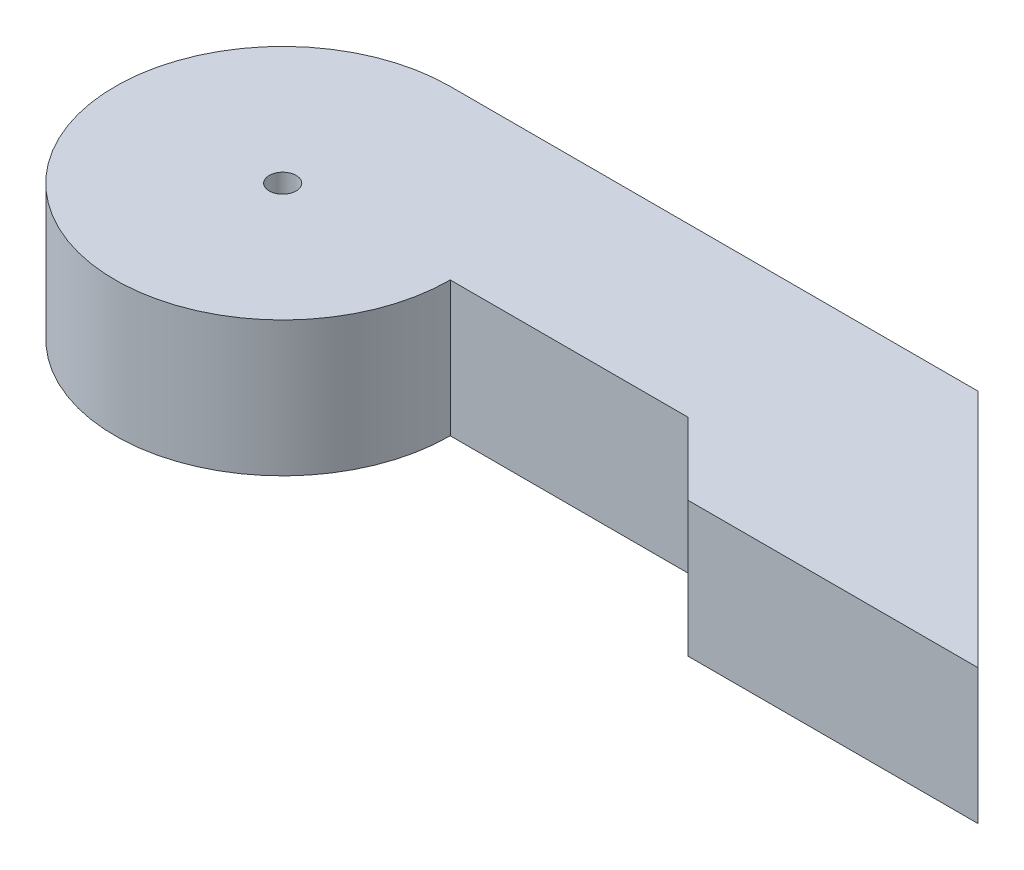
ISO-10303-21;
HEADER;
FILE_DESCRIPTION(('STEP AP214'),'2;1');
FILE_NAME('part.step','',(''),(''),'','','');
FILE_SCHEMA(('AUTOMOTIVE_DESIGN { 1 0 10303 214 1 1 1 1 }'));
ENDSEC;
DATA;
#1=APPLICATION_CONTEXT('core data for automotive mechanical design processes');
#2=APPLICATION_PROTOCOL_DEFINITION('international standard','automotive_design',2000,#1);
#3=PRODUCT_CONTEXT('',#1,'mechanical');
#4=PRODUCT('Part','Part','',(#3));
#5=PRODUCT_RELATED_PRODUCT_CATEGORY('part','',(#4));
#6=PRODUCT_DEFINITION_FORMATION('','',#4);
#7=PRODUCT_DEFINITION_CONTEXT('part definition',#1,'design');
#8=PRODUCT_DEFINITION('design','',#6,#7);
#9=PRODUCT_DEFINITION_SHAPE('','',#8);
#10=(LENGTH_UNIT() NAMED_UNIT(*) SI_UNIT(.MILLI.,.METRE.));
#11=(NAMED_UNIT(*) PLANE_ANGLE_UNIT() SI_UNIT($,.RADIAN.));
#12=(NAMED_UNIT(*) SI_UNIT($,.STERADIAN.) SOLID_ANGLE_UNIT());
#13=UNCERTAINTY_MEASURE_WITH_UNIT(LENGTH_MEASURE(1.E-05),#10,'distance_accuracy_value','');
#14=(GEOMETRIC_REPRESENTATION_CONTEXT(3) GLOBAL_UNCERTAINTY_ASSIGNED_CONTEXT((#13)) GLOBAL_UNIT_ASSIGNED_CONTEXT((#10,
#11,#12)) REPRESENTATION_CONTEXT('',''));
#15=CARTESIAN_POINT('',(0.,0.,0.));
#16=DIRECTION('',(0.,0.,1.));
#17=DIRECTION('',(1.,0.,0.));
#18=AXIS2_PLACEMENT_3D('',#15,#16,#17);
#19=CARTESIAN_POINT('',(0.,10.,0.));
#20=DIRECTION('',(0.,-1.,0.));
#21=DIRECTION('',(0.,0.,-1.));
#22=AXIS2_PLACEMENT_3D('',#19,#20,#21);
#23=CYLINDRICAL_SURFACE('',#22,12.4103970713268);
#24=CARTESIAN_POINT('',(0.,0.,0.));
#25=DIRECTION('',(0.,1.,0.));
#26=DIRECTION('',(0.,0.,1.));
#27=AXIS2_PLACEMENT_3D('',#24,#25,#26);
#28=CIRCLE('',#27,12.4103970713268);
#29=CARTESIAN_POINT('',(0.,0.,-12.4103970713268));
#30=VERTEX_POINT('',#29);
#31=CARTESIAN_POINT('',(12.4103970713268,0.,0.));
#32=VERTEX_POINT('',#31);
#33=EDGE_CURVE('E124',#30,#32,#28,.T.);
#34=ORIENTED_EDGE('',*,*,#33,.T.);
#35=DIRECTION('',(0.,-1.,0.));
#36=VECTOR('',#35,1.);
#37=CARTESIAN_POINT('',(12.4103970713268,10.,0.));
#38=LINE('',#37,#36);
#39=CARTESIAN_POINT('',(12.4103970713268,10.,0.));
#40=VERTEX_POINT('',#39);
#41=EDGE_CURVE('E11',#40,#32,#38,.T.);
#42=ORIENTED_EDGE('',*,*,#41,.F.);
#43=CARTESIAN_POINT('',(0.,10.,0.));
#44=DIRECTION('',(0.,1.,0.));
#45=DIRECTION('',(0.,0.,1.));
#46=AXIS2_PLACEMENT_3D('',#43,#44,#45);
#47=CIRCLE('',#46,12.4103970713268);
#48=CARTESIAN_POINT('',(0.,10.,-12.4103970713268));
#49=VERTEX_POINT('',#48);
#50=EDGE_CURVE('E139',#49,#40,#47,.T.);
#51=ORIENTED_EDGE('',*,*,#50,.F.);
#52=DIRECTION('',(0.,-1.,0.));
#53=VECTOR('',#52,1.);
#54=CARTESIAN_POINT('',(0.,10.,-12.4103970713268));
#55=LINE('',#54,#53);
#56=EDGE_CURVE('E51',#49,#30,#55,.T.);
#57=ORIENTED_EDGE('',*,*,#56,.T.);
#58=EDGE_LOOP('',(#34,#42,#51,#57));
#59=FACE_BOUND('',#58,.T.);
#60=ADVANCED_FACE('F35',(#59),#23,.T.);
#61=CARTESIAN_POINT('',(0.,10.,0.));
#62=DIRECTION('',(0.,0.,-1.));
#63=DIRECTION('',(-1.,0.,0.));
#64=AXIS2_PLACEMENT_3D('',#61,#62,#63);
#65=PLANE('',#64);
#66=DIRECTION('',(1.,0.,0.));
#67=VECTOR('',#66,1.);
#68=CARTESIAN_POINT('',(0.,0.,0.));
#69=LINE('',#68,#67);
#70=CARTESIAN_POINT('',(30.0174273392263,0.,0.));
#71=VERTEX_POINT('',#70);
#72=EDGE_CURVE('E126',#32,#71,#69,.T.);
#73=ORIENTED_EDGE('',*,*,#72,.T.);
#74=DIRECTION('',(0.,-1.,0.));
#75=VECTOR('',#74,1.);
#76=CARTESIAN_POINT('',(30.0174273392263,10.,0.));
#77=LINE('',#76,#75);
#78=CARTESIAN_POINT('',(30.0174273392263,10.,0.));
#79=VERTEX_POINT('',#78);
#80=EDGE_CURVE('E43',#79,#71,#77,.T.);
#81=ORIENTED_EDGE('',*,*,#80,.F.);
#82=DIRECTION('',(1.,0.,0.));
#83=VECTOR('',#82,1.);
#84=CARTESIAN_POINT('',(0.,10.,0.));
#85=LINE('',#84,#83);
#86=EDGE_CURVE('E84',#40,#79,#85,.T.);
#87=ORIENTED_EDGE('',*,*,#86,.F.);
#88=ORIENTED_EDGE('',*,*,#41,.T.);
#89=EDGE_LOOP('',(#73,#81,#87,#88));
#90=FACE_BOUND('',#89,.T.);
#91=ADVANCED_FACE('F161',(#90),#65,.F.);
#92=CARTESIAN_POINT('',(15.0087136696128,10.,-15.0087136696131));
#93=DIRECTION('',(0.707106781186539,0.,-0.707106781186556));
#94=DIRECTION('',(-0.707106781186556,0.,-0.707106781186539));
#95=AXIS2_PLACEMENT_3D('',#92,#93,#94);
#96=PLANE('',#95);
#97=DIRECTION('',(0.707106781186556,0.,0.707106781186539));
#98=VECTOR('',#97,1.);
#99=CARTESIAN_POINT('',(15.0087136696128,0.,-15.0087136696131));
#100=LINE('',#99,#98);
#101=CARTESIAN_POINT('',(35.3450154333778,0.,5.32758809415136));
#102=VERTEX_POINT('',#101);
#103=EDGE_CURVE('E128',#71,#102,#100,.T.);
#104=ORIENTED_EDGE('',*,*,#103,.T.);
#105=DIRECTION('',(0.,-1.,0.));
#106=VECTOR('',#105,1.);
#107=CARTESIAN_POINT('',(35.3450154333778,10.,5.32758809415136));
#108=LINE('',#107,#106);
#109=CARTESIAN_POINT('',(35.3450154333778,10.,5.32758809415136));
#110=VERTEX_POINT('',#109);
#111=EDGE_CURVE('E113',#110,#102,#108,.T.);
#112=ORIENTED_EDGE('',*,*,#111,.F.);
#113=DIRECTION('',(0.707106781186556,0.,0.707106781186539));
#114=VECTOR('',#113,1.);
#115=CARTESIAN_POINT('',(15.0087136696128,10.,-15.0087136696131));
#116=LINE('',#115,#114);
#117=EDGE_CURVE('E101',#79,#110,#116,.T.);
#118=ORIENTED_EDGE('',*,*,#117,.F.);
#119=ORIENTED_EDGE('',*,*,#80,.T.);
#120=EDGE_LOOP('',(#104,#112,#118,#119));
#121=FACE_BOUND('',#120,.T.);
#122=ADVANCED_FACE('F145',(#121),#96,.F.);
#123=CARTESIAN_POINT('',(0.,10.,5.32758809415137));
#124=DIRECTION('',(0.,0.,-1.));
#125=DIRECTION('',(-1.,0.,0.));
#126=AXIS2_PLACEMENT_3D('',#123,#124,#125);
#127=PLANE('',#126);
#128=DIRECTION('',(1.,0.,0.));
#129=VECTOR('',#128,1.);
#130=CARTESIAN_POINT('',(0.,0.,5.32758809415137));
#131=LINE('',#130,#129);
#132=CARTESIAN_POINT('',(56.8244368419088,0.,5.32758809415137));
#133=VERTEX_POINT('',#132);
#134=EDGE_CURVE('E110',#102,#133,#131,.T.);
#135=ORIENTED_EDGE('',*,*,#134,.T.);
#136=DIRECTION('',(0.,-1.,0.));
#137=VECTOR('',#136,1.);
#138=CARTESIAN_POINT('',(56.8244368419088,10.,5.32758809415137));
#139=LINE('',#138,#137);
#140=CARTESIAN_POINT('',(56.8244368419088,10.,5.32758809415137));
#141=VERTEX_POINT('',#140);
#142=EDGE_CURVE('E107',#141,#133,#139,.T.);
#143=ORIENTED_EDGE('',*,*,#142,.F.);
#144=DIRECTION('',(1.,0.,0.));
#145=VECTOR('',#144,1.);
#146=CARTESIAN_POINT('',(0.,10.,5.32758809415137));
#147=LINE('',#146,#145);
#148=EDGE_CURVE('E93',#110,#141,#147,.T.);
#149=ORIENTED_EDGE('',*,*,#148,.F.);
#150=ORIENTED_EDGE('',*,*,#111,.T.);
#151=EDGE_LOOP('',(#135,#143,#149,#150));
#152=FACE_BOUND('',#151,.T.);
#153=ADVANCED_FACE('F108',(#152),#127,.F.);
#154=CARTESIAN_POINT('',(25.7484243738781,10.,-25.7484243738786));
#155=DIRECTION('',(-0.70710678118654,0.,0.707106781186555));
#156=DIRECTION('',(0.707106781186555,0.,0.70710678118654));
#157=AXIS2_PLACEMENT_3D('',#154,#155,#156);
#158=PLANE('',#157);
#159=DIRECTION('',(-0.707106781186555,0.,-0.70710678118654));
#160=VECTOR('',#159,1.);
#161=CARTESIAN_POINT('',(25.7484243738781,0.,-25.7484243738786));
#162=LINE('',#161,#160);
#163=CARTESIAN_POINT('',(39.0864516764303,0.,-12.4103970713268));
#164=VERTEX_POINT('',#163);
#165=EDGE_CURVE('E131',#133,#164,#162,.T.);
#166=ORIENTED_EDGE('',*,*,#165,.T.);
#167=DIRECTION('',(0.,-1.,0.));
#168=VECTOR('',#167,1.);
#169=CARTESIAN_POINT('',(39.0864516764303,10.,-12.4103970713268));
#170=LINE('',#169,#168);
#171=CARTESIAN_POINT('',(39.0864516764303,10.,-12.4103970713268));
#172=VERTEX_POINT('',#171);
#173=EDGE_CURVE('E72',#172,#164,#170,.T.);
#174=ORIENTED_EDGE('',*,*,#173,.F.);
#175=DIRECTION('',(-0.707106781186555,0.,-0.70710678118654));
#176=VECTOR('',#175,1.);
#177=CARTESIAN_POINT('',(25.7484243738781,10.,-25.7484243738786));
#178=LINE('',#177,#176);
#179=EDGE_CURVE('E99',#141,#172,#178,.T.);
#180=ORIENTED_EDGE('',*,*,#179,.F.);
#181=ORIENTED_EDGE('',*,*,#142,.T.);
#182=EDGE_LOOP('',(#166,#174,#180,#181));
#183=FACE_BOUND('',#182,.T.);
#184=ADVANCED_FACE('F115',(#183),#158,.F.);
#185=CARTESIAN_POINT('',(0.,10.,-12.4103970713268));
#186=DIRECTION('',(0.,0.,-1.));
#187=DIRECTION('',(-1.,0.,0.));
#188=AXIS2_PLACEMENT_3D('',#185,#186,#187);
#189=PLANE('',#188);
#190=DIRECTION('',(1.,0.,0.));
#191=VECTOR('',#190,1.);
#192=CARTESIAN_POINT('',(0.,0.,-12.4103970713268));
#193=LINE('',#192,#191);
#194=EDGE_CURVE('E133',#30,#164,#193,.T.);
#195=ORIENTED_EDGE('',*,*,#194,.F.);
#196=ORIENTED_EDGE('',*,*,#56,.F.);
#197=DIRECTION('',(1.,0.,0.));
#198=VECTOR('',#197,1.);
#199=CARTESIAN_POINT('',(0.,10.,-12.4103970713268));
#200=LINE('',#199,#198);
#201=EDGE_CURVE('E116',#49,#172,#200,.T.);
#202=ORIENTED_EDGE('',*,*,#201,.T.);
#203=ORIENTED_EDGE('',*,*,#173,.T.);
#204=EDGE_LOOP('',(#195,#196,#202,#203));
#205=FACE_BOUND('',#204,.T.);
#206=ADVANCED_FACE('F149',(#205),#189,.T.);
#207=CARTESIAN_POINT('',(0.,10.,0.));
#208=DIRECTION('',(0.,-1.,0.));
#209=DIRECTION('',(0.,0.,-1.));
#210=AXIS2_PLACEMENT_3D('',#207,#208,#209);
#211=CYLINDRICAL_SURFACE('',#210,1.);
#212=CARTESIAN_POINT('',(0.,10.,0.));
#213=DIRECTION('',(0.,1.,0.));
#214=DIRECTION('',(0.,0.,1.));
#215=AXIS2_PLACEMENT_3D('',#212,#213,#214);
#216=CIRCLE('',#215,1.);
#217=CARTESIAN_POINT('',(0.,10.,1.));
#218=VERTEX_POINT('',#217);
#219=EDGE_CURVE('E118',#218,#218,#216,.T.);
#220=ORIENTED_EDGE('',*,*,#219,.T.);
#221=EDGE_LOOP('',(#220));
#222=FACE_BOUND('',#221,.T.);
#223=CARTESIAN_POINT('',(0.,0.,0.));
#224=DIRECTION('',(0.,1.,0.));
#225=DIRECTION('',(0.,0.,1.));
#226=AXIS2_PLACEMENT_3D('',#223,#224,#225);
#227=CIRCLE('',#226,1.);
#228=CARTESIAN_POINT('',(0.,0.,1.));
#229=VERTEX_POINT('',#228);
#230=EDGE_CURVE('E136',#229,#229,#227,.T.);
#231=ORIENTED_EDGE('',*,*,#230,.F.);
#232=EDGE_LOOP('',(#231));
#233=FACE_BOUND('',#232,.T.);
#234=ADVANCED_FACE('F151',(#222,#233),#211,.F.);
#235=CARTESIAN_POINT('',(0.,10.,0.));
#236=DIRECTION('',(0.,1.,0.));
#237=DIRECTION('',(0.,0.,1.));
#238=AXIS2_PLACEMENT_3D('',#235,#236,#237);
#239=PLANE('',#238);
#240=ORIENTED_EDGE('',*,*,#50,.T.);
#241=ORIENTED_EDGE('',*,*,#86,.T.);
#242=ORIENTED_EDGE('',*,*,#117,.T.);
#243=ORIENTED_EDGE('',*,*,#148,.T.);
#244=ORIENTED_EDGE('',*,*,#179,.T.);
#245=ORIENTED_EDGE('',*,*,#201,.F.);
#246=EDGE_LOOP('',(#240,#241,#242,#243,#244,#245));
#247=FACE_BOUND('',#246,.T.);
#248=ORIENTED_EDGE('',*,*,#219,.F.);
#249=EDGE_LOOP('',(#248));
#250=FACE_BOUND('',#249,.T.);
#251=ADVANCED_FACE('F95',(#247,#250),#239,.T.);
#252=CARTESIAN_POINT('',(0.,0.,0.));
#253=DIRECTION('',(0.,1.,0.));
#254=DIRECTION('',(0.,0.,1.));
#255=AXIS2_PLACEMENT_3D('',#252,#253,#254);
#256=PLANE('',#255);
#257=ORIENTED_EDGE('',*,*,#33,.F.);
#258=ORIENTED_EDGE('',*,*,#194,.T.);
#259=ORIENTED_EDGE('',*,*,#165,.F.);
#260=ORIENTED_EDGE('',*,*,#134,.F.);
#261=ORIENTED_EDGE('',*,*,#103,.F.);
#262=ORIENTED_EDGE('',*,*,#72,.F.);
#263=EDGE_LOOP('',(#257,#258,#259,#260,#261,#262));
#264=FACE_BOUND('',#263,.T.);
#265=ORIENTED_EDGE('',*,*,#230,.T.);
#266=EDGE_LOOP('',(#265));
#267=FACE_BOUND('',#266,.T.);
#268=ADVANCED_FACE('F147',(#264,#267),#256,.F.);
#269=CLOSED_SHELL('',(#60,#91,#122,#153,#184,#206,#234,#251,#268));
#270=MANIFOLD_SOLID_BREP('B2',#269);
#271=ADVANCED_BREP_SHAPE_REPRESENTATION('',(#18,#270),#14);
#272=SHAPE_DEFINITION_REPRESENTATION(#9,#271);
ENDSEC;
END-ISO-10303-21;
